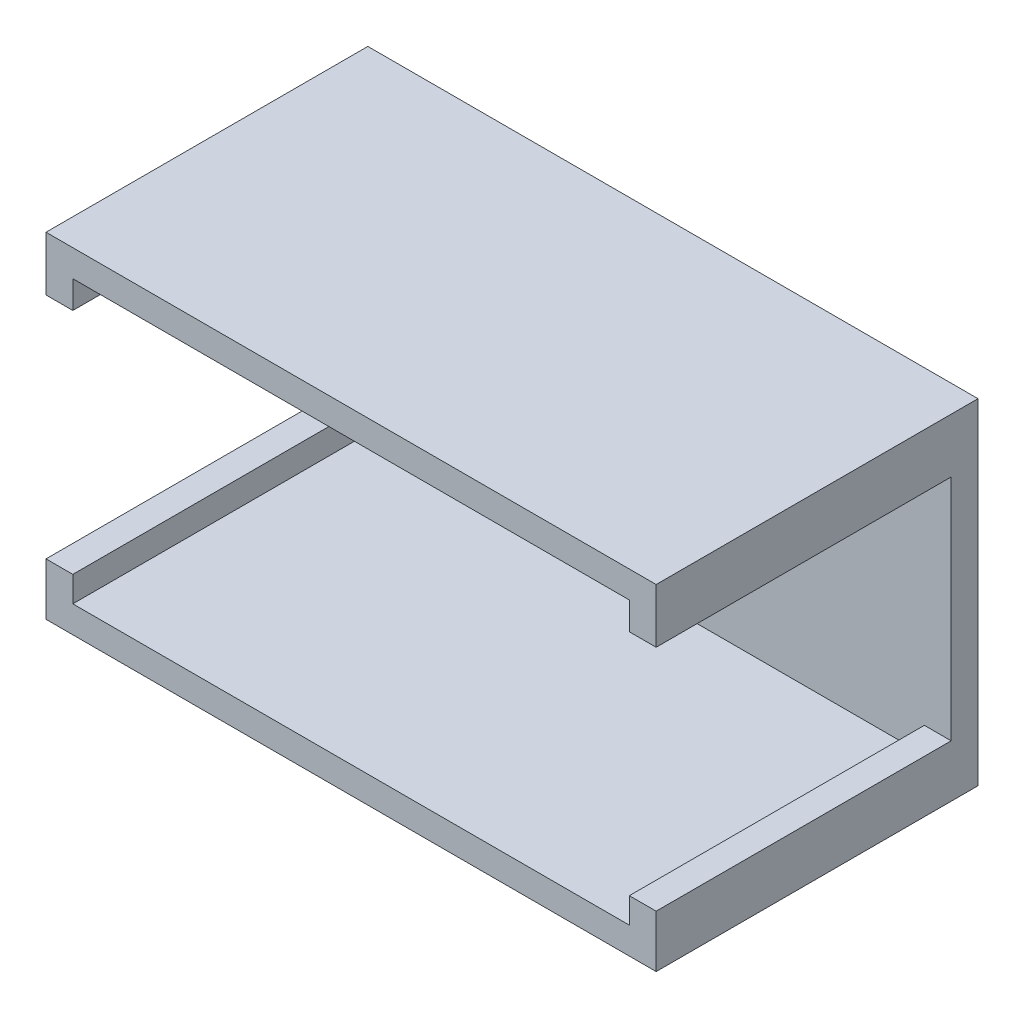
ISO-10303-21;
HEADER;
FILE_DESCRIPTION(('STEP AP214'),'2;1');
FILE_NAME('part.step','',(''),(''),'','','');
FILE_SCHEMA(('AUTOMOTIVE_DESIGN { 1 0 10303 214 1 1 1 1 }'));
ENDSEC;
DATA;
#1=APPLICATION_CONTEXT('core data for automotive mechanical design processes');
#2=APPLICATION_PROTOCOL_DEFINITION('international standard','automotive_design',2000,#1);
#3=PRODUCT_CONTEXT('',#1,'mechanical');
#4=PRODUCT('Part','Part','',(#3));
#5=PRODUCT_RELATED_PRODUCT_CATEGORY('part','',(#4));
#6=PRODUCT_DEFINITION_FORMATION('','',#4);
#7=PRODUCT_DEFINITION_CONTEXT('part definition',#1,'design');
#8=PRODUCT_DEFINITION('design','',#6,#7);
#9=PRODUCT_DEFINITION_SHAPE('','',#8);
#10=(LENGTH_UNIT() NAMED_UNIT(*) SI_UNIT(.MILLI.,.METRE.));
#11=(NAMED_UNIT(*) PLANE_ANGLE_UNIT() SI_UNIT($,.RADIAN.));
#12=(NAMED_UNIT(*) SI_UNIT($,.STERADIAN.) SOLID_ANGLE_UNIT());
#13=UNCERTAINTY_MEASURE_WITH_UNIT(LENGTH_MEASURE(1.E-05),#10,'distance_accuracy_value','');
#14=(GEOMETRIC_REPRESENTATION_CONTEXT(3) GLOBAL_UNCERTAINTY_ASSIGNED_CONTEXT((#13)) GLOBAL_UNIT_ASSIGNED_CONTEXT((#10,
#11,#12)) REPRESENTATION_CONTEXT('',''));
#15=CARTESIAN_POINT('',(0.,0.,0.));
#16=DIRECTION('',(0.,0.,1.));
#17=DIRECTION('',(1.,0.,0.));
#18=AXIS2_PLACEMENT_3D('',#15,#16,#17);
#19=CARTESIAN_POINT('',(-48.9395510953457,26.5034566253615,2.));
#20=DIRECTION('',(0.,-1.,0.));
#21=DIRECTION('',(0.,0.,-1.));
#22=AXIS2_PLACEMENT_3D('',#19,#20,#21);
#23=PLANE('',#22);
#24=DIRECTION('',(0.,0.,-1.));
#25=VECTOR('',#24,1.);
#26=CARTESIAN_POINT('',(-49.9395510953457,26.5034566253615,2.));
#27=LINE('',#26,#25);
#28=CARTESIAN_POINT('',(-49.9395510953457,26.5034566253615,24.));
#29=VERTEX_POINT('',#28);
#30=CARTESIAN_POINT('',(-49.9395510953457,26.5034566253615,0.));
#31=VERTEX_POINT('',#30);
#32=EDGE_CURVE('E11',#29,#31,#27,.T.);
#33=ORIENTED_EDGE('',*,*,#32,.F.);
#34=DIRECTION('',(1.,0.,0.));
#35=VECTOR('',#34,1.);
#36=CARTESIAN_POINT('',(-48.9395510953457,26.5034566253615,24.));
#37=LINE('',#36,#35);
#38=CARTESIAN_POINT('',(-4.43955109534567,26.5034566253615,24.));
#39=VERTEX_POINT('',#38);
#40=EDGE_CURVE('E149',#29,#39,#37,.T.);
#41=ORIENTED_EDGE('',*,*,#40,.T.);
#42=DIRECTION('',(0.,0.,-1.));
#43=VECTOR('',#42,1.);
#44=CARTESIAN_POINT('',(-4.43955109534567,26.5034566253615,2.));
#45=LINE('',#44,#43);
#46=CARTESIAN_POINT('',(-4.43955109534567,26.5034566253615,0.));
#47=VERTEX_POINT('',#46);
#48=EDGE_CURVE('E161',#39,#47,#45,.T.);
#49=ORIENTED_EDGE('',*,*,#48,.T.);
#50=DIRECTION('',(-1.,0.,0.));
#51=VECTOR('',#50,1.);
#52=CARTESIAN_POINT('',(-48.9395510953457,26.5034566253615,0.));
#53=LINE('',#52,#51);
#54=EDGE_CURVE('E171',#47,#31,#53,.T.);
#55=ORIENTED_EDGE('',*,*,#54,.T.);
#56=EDGE_LOOP('',(#33,#41,#49,#55));
#57=FACE_BOUND('',#56,.T.);
#58=ADVANCED_FACE('F33',(#57),#23,.F.);
#59=CARTESIAN_POINT('',(0.,0.,24.));
#60=DIRECTION('',(0.,0.,-1.));
#61=DIRECTION('',(-1.,0.,0.));
#62=AXIS2_PLACEMENT_3D('',#59,#60,#61);
#63=PLANE('',#62);
#64=DIRECTION('',(0.,1.,0.));
#65=VECTOR('',#64,1.);
#66=CARTESIAN_POINT('',(-4.43955109534567,26.5034566253615,24.));
#67=LINE('',#66,#65);
#68=CARTESIAN_POINT('',(-4.43955109534567,22.4484935609555,24.));
#69=VERTEX_POINT('',#68);
#70=EDGE_CURVE('E146',#69,#39,#67,.T.);
#71=ORIENTED_EDGE('',*,*,#70,.T.);
#72=ORIENTED_EDGE('',*,*,#40,.F.);
#73=DIRECTION('',(0.,-1.,0.));
#74=VECTOR('',#73,1.);
#75=CARTESIAN_POINT('',(-49.9395510953457,26.5034566253615,24.));
#76=LINE('',#75,#74);
#77=CARTESIAN_POINT('',(-49.9395510953457,22.4484935609555,24.));
#78=VERTEX_POINT('',#77);
#79=EDGE_CURVE('E210',#29,#78,#76,.T.);
#80=ORIENTED_EDGE('',*,*,#79,.T.);
#81=DIRECTION('',(1.,0.,0.));
#82=VECTOR('',#81,1.);
#83=CARTESIAN_POINT('',(0.,22.4484935609555,24.));
#84=LINE('',#83,#82);
#85=CARTESIAN_POINT('',(-47.9395510953457,22.4484935609555,24.));
#86=VERTEX_POINT('',#85);
#87=EDGE_CURVE('E245',#78,#86,#84,.T.);
#88=ORIENTED_EDGE('',*,*,#87,.T.);
#89=DIRECTION('',(0.,-1.,0.));
#90=VECTOR('',#89,1.);
#91=CARTESIAN_POINT('',(-47.9395510953457,5.50345662536146,24.));
#92=LINE('',#91,#90);
#93=CARTESIAN_POINT('',(-47.9395510953457,24.5034566253615,24.));
#94=VERTEX_POINT('',#93);
#95=EDGE_CURVE('E222',#94,#86,#92,.T.);
#96=ORIENTED_EDGE('',*,*,#95,.F.);
#97=DIRECTION('',(1.,0.,0.));
#98=VECTOR('',#97,1.);
#99=CARTESIAN_POINT('',(-47.9395510953457,24.5034566253615,24.));
#100=LINE('',#99,#98);
#101=CARTESIAN_POINT('',(-6.43955109534567,24.5034566253615,24.));
#102=VERTEX_POINT('',#101);
#103=EDGE_CURVE('E163',#94,#102,#100,.T.);
#104=ORIENTED_EDGE('',*,*,#103,.T.);
#105=DIRECTION('',(0.,1.,0.));
#106=VECTOR('',#105,1.);
#107=CARTESIAN_POINT('',(-6.43955109534567,24.5034566253615,24.));
#108=LINE('',#107,#106);
#109=CARTESIAN_POINT('',(-6.43955109534567,22.4484935609555,24.));
#110=VERTEX_POINT('',#109);
#111=EDGE_CURVE('E229',#110,#102,#108,.T.);
#112=ORIENTED_EDGE('',*,*,#111,.F.);
#113=EDGE_CURVE('E152',#110,#69,#84,.T.);
#114=ORIENTED_EDGE('',*,*,#113,.T.);
#115=EDGE_LOOP('',(#71,#72,#80,#88,#96,#104,#112,#114));
#116=FACE_BOUND('',#115,.T.);
#117=ADVANCED_FACE('F148',(#116),#63,.F.);
#118=CARTESIAN_POINT('',(-6.43955109534567,24.5034566253615,24.));
#119=DIRECTION('',(-1.,0.,0.));
#120=DIRECTION('',(0.,0.,1.));
#121=AXIS2_PLACEMENT_3D('',#118,#119,#120);
#122=PLANE('',#121);
#123=DIRECTION('',(0.,0.,-1.));
#124=VECTOR('',#123,1.);
#125=CARTESIAN_POINT('',(-6.43955109534567,22.4484935609555,24.));
#126=LINE('',#125,#124);
#127=CARTESIAN_POINT('',(-6.43955109534568,22.4484935609555,2.));
#128=VERTEX_POINT('',#127);
#129=EDGE_CURVE('E240',#110,#128,#126,.T.);
#130=ORIENTED_EDGE('',*,*,#129,.F.);
#131=ORIENTED_EDGE('',*,*,#111,.T.);
#132=DIRECTION('',(0.,0.,-1.));
#133=VECTOR('',#132,1.);
#134=CARTESIAN_POINT('',(-6.43955109534567,24.5034566253615,24.));
#135=LINE('',#134,#133);
#136=CARTESIAN_POINT('',(-6.43955109534567,24.5034566253615,2.));
#137=VERTEX_POINT('',#136);
#138=EDGE_CURVE('E215',#102,#137,#135,.T.);
#139=ORIENTED_EDGE('',*,*,#138,.T.);
#140=DIRECTION('',(0.,-1.,0.));
#141=VECTOR('',#140,1.);
#142=CARTESIAN_POINT('',(-6.43955109534567,0.,2.));
#143=LINE('',#142,#141);
#144=EDGE_CURVE('E191',#137,#128,#143,.T.);
#145=ORIENTED_EDGE('',*,*,#144,.T.);
#146=EDGE_LOOP('',(#130,#131,#139,#145));
#147=FACE_BOUND('',#146,.T.);
#148=ADVANCED_FACE('F274',(#147),#122,.T.);
#149=CARTESIAN_POINT('',(-47.9395510953457,3.50345662536146,24.));
#150=DIRECTION('',(1.,0.,0.));
#151=DIRECTION('',(0.,0.,-1.));
#152=AXIS2_PLACEMENT_3D('',#149,#150,#151);
#153=PLANE('',#152);
#154=DIRECTION('',(0.,0.,1.));
#155=VECTOR('',#154,1.);
#156=CARTESIAN_POINT('',(-47.9395510953457,22.4484935609555,24.));
#157=LINE('',#156,#155);
#158=CARTESIAN_POINT('',(-47.9395510953457,22.4484935609555,2.));
#159=VERTEX_POINT('',#158);
#160=EDGE_CURVE('E248',#159,#86,#157,.T.);
#161=ORIENTED_EDGE('',*,*,#160,.F.);
#162=DIRECTION('',(0.,1.,0.));
#163=VECTOR('',#162,1.);
#164=CARTESIAN_POINT('',(-47.9395510953457,0.,2.));
#165=LINE('',#164,#163);
#166=CARTESIAN_POINT('',(-47.9395510953457,24.5034566253615,2.));
#167=VERTEX_POINT('',#166);
#168=EDGE_CURVE('E204',#159,#167,#165,.T.);
#169=ORIENTED_EDGE('',*,*,#168,.T.);
#170=DIRECTION('',(0.,0.,-1.));
#171=VECTOR('',#170,1.);
#172=CARTESIAN_POINT('',(-47.9395510953457,24.5034566253615,24.));
#173=LINE('',#172,#171);
#174=EDGE_CURVE('E217',#94,#167,#173,.T.);
#175=ORIENTED_EDGE('',*,*,#174,.F.);
#176=ORIENTED_EDGE('',*,*,#95,.T.);
#177=EDGE_LOOP('',(#161,#169,#175,#176));
#178=FACE_BOUND('',#177,.T.);
#179=ADVANCED_FACE('F309',(#178),#153,.T.);
#180=CARTESIAN_POINT('',(-49.9395510953457,5.50345662536146,2.));
#181=DIRECTION('',(1.,0.,0.));
#182=DIRECTION('',(0.,0.,-1.));
#183=AXIS2_PLACEMENT_3D('',#180,#181,#182);
#184=PLANE('',#183);
#185=ORIENTED_EDGE('',*,*,#79,.F.);
#186=ORIENTED_EDGE('',*,*,#32,.T.);
#187=DIRECTION('',(0.,-1.,0.));
#188=VECTOR('',#187,1.);
#189=CARTESIAN_POINT('',(-49.9395510953457,5.50345662536146,0.));
#190=LINE('',#189,#188);
#191=CARTESIAN_POINT('',(-49.9395510953457,1.50345662536146,0.));
#192=VERTEX_POINT('',#191);
#193=EDGE_CURVE('E189',#31,#192,#190,.T.);
#194=ORIENTED_EDGE('',*,*,#193,.T.);
#195=DIRECTION('',(0.,0.,-1.));
#196=VECTOR('',#195,1.);
#197=CARTESIAN_POINT('',(-49.9395510953457,1.50345662536146,2.));
#198=LINE('',#197,#196);
#199=CARTESIAN_POINT('',(-49.9395510953457,1.50345662536146,24.));
#200=VERTEX_POINT('',#199);
#201=EDGE_CURVE('E41',#200,#192,#198,.T.);
#202=ORIENTED_EDGE('',*,*,#201,.F.);
#203=CARTESIAN_POINT('',(-49.9395510953457,5.40766491915159,24.));
#204=VERTEX_POINT('',#203);
#205=EDGE_CURVE('E187',#204,#200,#76,.T.);
#206=ORIENTED_EDGE('',*,*,#205,.F.);
#207=DIRECTION('',(0.,0.,-1.));
#208=VECTOR('',#207,1.);
#209=CARTESIAN_POINT('',(-49.9395510953457,5.40766491915159,2.));
#210=LINE('',#209,#208);
#211=CARTESIAN_POINT('',(-49.9395510953457,5.40766491915159,2.));
#212=VERTEX_POINT('',#211);
#213=EDGE_CURVE('E256',#204,#212,#210,.T.);
#214=ORIENTED_EDGE('',*,*,#213,.T.);
#215=DIRECTION('',(0.,1.,0.));
#216=VECTOR('',#215,1.);
#217=CARTESIAN_POINT('',(-49.9395510953457,5.50345662536146,2.));
#218=LINE('',#217,#216);
#219=CARTESIAN_POINT('',(-49.9395510953457,22.4484935609555,2.));
#220=VERTEX_POINT('',#219);
#221=EDGE_CURVE('E232',#212,#220,#218,.T.);
#222=ORIENTED_EDGE('',*,*,#221,.T.);
#223=DIRECTION('',(0.,0.,1.));
#224=VECTOR('',#223,1.);
#225=CARTESIAN_POINT('',(-49.9395510953457,22.4484935609555,2.));
#226=LINE('',#225,#224);
#227=EDGE_CURVE('E242',#220,#78,#226,.T.);
#228=ORIENTED_EDGE('',*,*,#227,.T.);
#229=EDGE_LOOP('',(#185,#186,#194,#202,#206,#214,#222,#228));
#230=FACE_BOUND('',#229,.T.);
#231=ADVANCED_FACE('F35',(#230),#184,.F.);
#232=CARTESIAN_POINT('',(-4.43955109534567,1.50345662536146,2.));
#233=DIRECTION('',(0.,1.,0.));
#234=DIRECTION('',(0.,0.,1.));
#235=AXIS2_PLACEMENT_3D('',#232,#233,#234);
#236=PLANE('',#235);
#237=DIRECTION('',(1.,0.,0.));
#238=VECTOR('',#237,1.);
#239=CARTESIAN_POINT('',(-4.43955109534567,1.50345662536146,0.));
#240=LINE('',#239,#238);
#241=CARTESIAN_POINT('',(-4.43955109534567,1.50345662536146,0.));
#242=VERTEX_POINT('',#241);
#243=EDGE_CURVE('E181',#192,#242,#240,.T.);
#244=ORIENTED_EDGE('',*,*,#243,.T.);
#245=DIRECTION('',(0.,0.,-1.));
#246=VECTOR('',#245,1.);
#247=CARTESIAN_POINT('',(-4.43955109534567,1.50345662536146,2.));
#248=LINE('',#247,#246);
#249=CARTESIAN_POINT('',(-4.43955109534568,1.50345662536146,24.));
#250=VERTEX_POINT('',#249);
#251=EDGE_CURVE('E170',#250,#242,#248,.T.);
#252=ORIENTED_EDGE('',*,*,#251,.F.);
#253=DIRECTION('',(1.,0.,0.));
#254=VECTOR('',#253,1.);
#255=CARTESIAN_POINT('',(-4.43955109534568,1.50345662536146,24.));
#256=LINE('',#255,#254);
#257=EDGE_CURVE('E157',#200,#250,#256,.T.);
#258=ORIENTED_EDGE('',*,*,#257,.F.);
#259=ORIENTED_EDGE('',*,*,#201,.T.);
#260=EDGE_LOOP('',(#244,#252,#258,#259));
#261=FACE_BOUND('',#260,.T.);
#262=ADVANCED_FACE('F180',(#261),#236,.F.);
#263=CARTESIAN_POINT('',(-4.43955109534567,26.5034566253615,2.));
#264=DIRECTION('',(-1.,0.,0.));
#265=DIRECTION('',(0.,0.,1.));
#266=AXIS2_PLACEMENT_3D('',#263,#264,#265);
#267=PLANE('',#266);
#268=ORIENTED_EDGE('',*,*,#48,.F.);
#269=ORIENTED_EDGE('',*,*,#70,.F.);
#270=DIRECTION('',(0.,0.,-1.));
#271=VECTOR('',#270,1.);
#272=CARTESIAN_POINT('',(-4.43955109534567,22.4484935609555,2.));
#273=LINE('',#272,#271);
#274=CARTESIAN_POINT('',(-4.43955109534568,22.4484935609555,2.));
#275=VERTEX_POINT('',#274);
#276=EDGE_CURVE('E238',#69,#275,#273,.T.);
#277=ORIENTED_EDGE('',*,*,#276,.T.);
#278=DIRECTION('',(0.,-1.,0.));
#279=VECTOR('',#278,1.);
#280=CARTESIAN_POINT('',(-4.43955109534567,26.5034566253615,2.));
#281=LINE('',#280,#279);
#282=CARTESIAN_POINT('',(-4.43955109534568,5.40766491915159,2.));
#283=VERTEX_POINT('',#282);
#284=EDGE_CURVE('E235',#275,#283,#281,.T.);
#285=ORIENTED_EDGE('',*,*,#284,.T.);
#286=DIRECTION('',(0.,0.,1.));
#287=VECTOR('',#286,1.);
#288=CARTESIAN_POINT('',(-4.43955109534567,5.40766491915159,2.));
#289=LINE('',#288,#287);
#290=CARTESIAN_POINT('',(-4.43955109534567,5.40766491915159,24.));
#291=VERTEX_POINT('',#290);
#292=EDGE_CURVE('E250',#283,#291,#289,.T.);
#293=ORIENTED_EDGE('',*,*,#292,.T.);
#294=EDGE_CURVE('E156',#250,#291,#67,.T.);
#295=ORIENTED_EDGE('',*,*,#294,.F.);
#296=ORIENTED_EDGE('',*,*,#251,.T.);
#297=DIRECTION('',(0.,1.,0.));
#298=VECTOR('',#297,1.);
#299=CARTESIAN_POINT('',(-4.43955109534567,26.5034566253615,0.));
#300=LINE('',#299,#298);
#301=EDGE_CURVE('E169',#242,#47,#300,.T.);
#302=ORIENTED_EDGE('',*,*,#301,.T.);
#303=EDGE_LOOP('',(#268,#269,#277,#285,#293,#295,#296,#302));
#304=FACE_BOUND('',#303,.T.);
#305=ADVANCED_FACE('F166',(#304),#267,.F.);
#306=CARTESIAN_POINT('',(0.,0.,0.));
#307=DIRECTION('',(0.,0.,1.));
#308=DIRECTION('',(1.,0.,0.));
#309=AXIS2_PLACEMENT_3D('',#306,#307,#308);
#310=PLANE('',#309);
#311=ORIENTED_EDGE('',*,*,#193,.F.);
#312=ORIENTED_EDGE('',*,*,#54,.F.);
#313=ORIENTED_EDGE('',*,*,#301,.F.);
#314=ORIENTED_EDGE('',*,*,#243,.F.);
#315=EDGE_LOOP('',(#311,#312,#313,#314));
#316=FACE_BOUND('',#315,.T.);
#317=ADVANCED_FACE('F329',(#316),#310,.F.);
#318=ORIENTED_EDGE('',*,*,#294,.T.);
#319=DIRECTION('',(-1.,0.,0.));
#320=VECTOR('',#319,1.);
#321=CARTESIAN_POINT('',(0.,5.40766491915159,24.));
#322=LINE('',#321,#320);
#323=CARTESIAN_POINT('',(-6.43955109534567,5.40766491915159,24.));
#324=VERTEX_POINT('',#323);
#325=EDGE_CURVE('E253',#291,#324,#322,.T.);
#326=ORIENTED_EDGE('',*,*,#325,.T.);
#327=CARTESIAN_POINT('',(-6.43955109534567,3.50345662536146,24.));
#328=VERTEX_POINT('',#327);
#329=EDGE_CURVE('E226',#328,#324,#108,.T.);
#330=ORIENTED_EDGE('',*,*,#329,.F.);
#331=DIRECTION('',(1.,0.,0.));
#332=VECTOR('',#331,1.);
#333=CARTESIAN_POINT('',(-6.43955109534567,3.50345662536146,24.));
#334=LINE('',#333,#332);
#335=CARTESIAN_POINT('',(-47.9395510953457,3.50345662536146,24.));
#336=VERTEX_POINT('',#335);
#337=EDGE_CURVE('E230',#336,#328,#334,.T.);
#338=ORIENTED_EDGE('',*,*,#337,.F.);
#339=CARTESIAN_POINT('',(-47.9395510953457,5.40766491915159,24.));
#340=VERTEX_POINT('',#339);
#341=EDGE_CURVE('E225',#340,#336,#92,.T.);
#342=ORIENTED_EDGE('',*,*,#341,.F.);
#343=EDGE_CURVE('E48',#340,#204,#322,.T.);
#344=ORIENTED_EDGE('',*,*,#343,.T.);
#345=ORIENTED_EDGE('',*,*,#205,.T.);
#346=ORIENTED_EDGE('',*,*,#257,.T.);
#347=EDGE_LOOP('',(#318,#326,#330,#338,#342,#344,#345,#346));
#348=FACE_BOUND('',#347,.T.);
#349=ADVANCED_FACE('F290',(#348),#63,.F.);
#350=DIRECTION('',(0.,0.,1.));
#351=VECTOR('',#350,1.);
#352=CARTESIAN_POINT('',(-6.43955109534567,5.40766491915159,24.));
#353=LINE('',#352,#351);
#354=CARTESIAN_POINT('',(-6.43955109534567,5.40766491915159,2.));
#355=VERTEX_POINT('',#354);
#356=EDGE_CURVE('E254',#355,#324,#353,.T.);
#357=ORIENTED_EDGE('',*,*,#356,.F.);
#358=CARTESIAN_POINT('',(-6.43955109534567,3.50345662536146,2.));
#359=VERTEX_POINT('',#358);
#360=EDGE_CURVE('E195',#355,#359,#143,.T.);
#361=ORIENTED_EDGE('',*,*,#360,.T.);
#362=DIRECTION('',(0.,0.,-1.));
#363=VECTOR('',#362,1.);
#364=CARTESIAN_POINT('',(-6.43955109534567,3.50345662536146,24.));
#365=LINE('',#364,#363);
#366=EDGE_CURVE('E212',#328,#359,#365,.T.);
#367=ORIENTED_EDGE('',*,*,#366,.F.);
#368=ORIENTED_EDGE('',*,*,#329,.T.);
#369=EDGE_LOOP('',(#357,#361,#367,#368));
#370=FACE_BOUND('',#369,.T.);
#371=ADVANCED_FACE('F317',(#370),#122,.T.);
#372=CARTESIAN_POINT('',(-47.9395510953457,24.5034566253615,24.));
#373=DIRECTION('',(0.,-1.,0.));
#374=DIRECTION('',(0.,0.,-1.));
#375=AXIS2_PLACEMENT_3D('',#372,#373,#374);
#376=PLANE('',#375);
#377=ORIENTED_EDGE('',*,*,#103,.F.);
#378=ORIENTED_EDGE('',*,*,#174,.T.);
#379=DIRECTION('',(1.,0.,0.));
#380=VECTOR('',#379,1.);
#381=CARTESIAN_POINT('',(0.,24.5034566253615,2.));
#382=LINE('',#381,#380);
#383=EDGE_CURVE('E198',#167,#137,#382,.T.);
#384=ORIENTED_EDGE('',*,*,#383,.T.);
#385=ORIENTED_EDGE('',*,*,#138,.F.);
#386=EDGE_LOOP('',(#377,#378,#384,#385));
#387=FACE_BOUND('',#386,.T.);
#388=ADVANCED_FACE('F276',(#387),#376,.T.);
#389=DIRECTION('',(0.,0.,-1.));
#390=VECTOR('',#389,1.);
#391=CARTESIAN_POINT('',(-47.9395510953457,5.40766491915159,24.));
#392=LINE('',#391,#390);
#393=CARTESIAN_POINT('',(-47.9395510953457,5.40766491915159,2.));
#394=VERTEX_POINT('',#393);
#395=EDGE_CURVE('E259',#340,#394,#392,.T.);
#396=ORIENTED_EDGE('',*,*,#395,.F.);
#397=ORIENTED_EDGE('',*,*,#341,.T.);
#398=DIRECTION('',(0.,0.,-1.));
#399=VECTOR('',#398,1.);
#400=CARTESIAN_POINT('',(-47.9395510953457,3.50345662536146,24.));
#401=LINE('',#400,#399);
#402=CARTESIAN_POINT('',(-47.9395510953457,3.50345662536146,2.));
#403=VERTEX_POINT('',#402);
#404=EDGE_CURVE('E219',#336,#403,#401,.T.);
#405=ORIENTED_EDGE('',*,*,#404,.T.);
#406=EDGE_CURVE('E201',#403,#394,#165,.T.);
#407=ORIENTED_EDGE('',*,*,#406,.T.);
#408=EDGE_LOOP('',(#396,#397,#405,#407));
#409=FACE_BOUND('',#408,.T.);
#410=ADVANCED_FACE('F296',(#409),#153,.T.);
#411=CARTESIAN_POINT('',(-10.4395510953457,3.50345662536146,24.));
#412=DIRECTION('',(0.,1.,0.));
#413=DIRECTION('',(0.,0.,1.));
#414=AXIS2_PLACEMENT_3D('',#411,#412,#413);
#415=PLANE('',#414);
#416=ORIENTED_EDGE('',*,*,#366,.T.);
#417=DIRECTION('',(-1.,0.,0.));
#418=VECTOR('',#417,1.);
#419=CARTESIAN_POINT('',(0.,3.50345662536146,2.));
#420=LINE('',#419,#418);
#421=EDGE_CURVE('E205',#359,#403,#420,.T.);
#422=ORIENTED_EDGE('',*,*,#421,.T.);
#423=ORIENTED_EDGE('',*,*,#404,.F.);
#424=ORIENTED_EDGE('',*,*,#337,.T.);
#425=EDGE_LOOP('',(#416,#422,#423,#424));
#426=FACE_BOUND('',#425,.T.);
#427=ADVANCED_FACE('F298',(#426),#415,.T.);
#428=CARTESIAN_POINT('',(0.,0.,2.));
#429=DIRECTION('',(0.,0.,1.));
#430=DIRECTION('',(1.,0.,0.));
#431=AXIS2_PLACEMENT_3D('',#428,#429,#430);
#432=PLANE('',#431);
#433=ORIENTED_EDGE('',*,*,#360,.F.);
#434=DIRECTION('',(1.,0.,0.));
#435=VECTOR('',#434,1.);
#436=CARTESIAN_POINT('',(-70.1,5.40766491915159,2.));
#437=LINE('',#436,#435);
#438=EDGE_CURVE('E56',#355,#283,#437,.T.);
#439=ORIENTED_EDGE('',*,*,#438,.T.);
#440=ORIENTED_EDGE('',*,*,#284,.F.);
#441=DIRECTION('',(1.,0.,0.));
#442=VECTOR('',#441,1.);
#443=CARTESIAN_POINT('',(-70.1,22.4484935609555,2.));
#444=LINE('',#443,#442);
#445=EDGE_CURVE('E264',#128,#275,#444,.T.);
#446=ORIENTED_EDGE('',*,*,#445,.F.);
#447=ORIENTED_EDGE('',*,*,#144,.F.);
#448=ORIENTED_EDGE('',*,*,#383,.F.);
#449=ORIENTED_EDGE('',*,*,#168,.F.);
#450=EDGE_CURVE('E261',#220,#159,#444,.T.);
#451=ORIENTED_EDGE('',*,*,#450,.F.);
#452=ORIENTED_EDGE('',*,*,#221,.F.);
#453=EDGE_CURVE('E263',#212,#394,#437,.T.);
#454=ORIENTED_EDGE('',*,*,#453,.T.);
#455=ORIENTED_EDGE('',*,*,#406,.F.);
#456=ORIENTED_EDGE('',*,*,#421,.F.);
#457=EDGE_LOOP('',(#433,#439,#440,#446,#447,#448,#449,#451,#452,#454,#455,#456));
#458=FACE_BOUND('',#457,.T.);
#459=ADVANCED_FACE('F282',(#458),#432,.T.);
#460=CARTESIAN_POINT('',(-70.1,5.40766491915159,2.));
#461=DIRECTION('',(0.,-1.,0.));
#462=DIRECTION('',(0.,0.,-1.));
#463=AXIS2_PLACEMENT_3D('',#460,#461,#462);
#464=PLANE('',#463);
#465=ORIENTED_EDGE('',*,*,#343,.F.);
#466=ORIENTED_EDGE('',*,*,#395,.T.);
#467=ORIENTED_EDGE('',*,*,#453,.F.);
#468=ORIENTED_EDGE('',*,*,#213,.F.);
#469=EDGE_LOOP('',(#465,#466,#467,#468));
#470=FACE_BOUND('',#469,.T.);
#471=ADVANCED_FACE('F303',(#470),#464,.F.);
#472=CARTESIAN_POINT('',(-70.1,22.4484935609555,2.));
#473=DIRECTION('',(0.,1.,0.));
#474=DIRECTION('',(0.,0.,1.));
#475=AXIS2_PLACEMENT_3D('',#472,#473,#474);
#476=PLANE('',#475);
#477=ORIENTED_EDGE('',*,*,#450,.T.);
#478=ORIENTED_EDGE('',*,*,#160,.T.);
#479=ORIENTED_EDGE('',*,*,#87,.F.);
#480=ORIENTED_EDGE('',*,*,#227,.F.);
#481=EDGE_LOOP('',(#477,#478,#479,#480));
#482=FACE_BOUND('',#481,.T.);
#483=ADVANCED_FACE('F306',(#482),#476,.F.);
#484=ORIENTED_EDGE('',*,*,#113,.F.);
#485=ORIENTED_EDGE('',*,*,#129,.T.);
#486=ORIENTED_EDGE('',*,*,#445,.T.);
#487=ORIENTED_EDGE('',*,*,#276,.F.);
#488=EDGE_LOOP('',(#484,#485,#486,#487));
#489=FACE_BOUND('',#488,.T.);
#490=ADVANCED_FACE('F286',(#489),#476,.F.);
#491=ORIENTED_EDGE('',*,*,#438,.F.);
#492=ORIENTED_EDGE('',*,*,#356,.T.);
#493=ORIENTED_EDGE('',*,*,#325,.F.);
#494=ORIENTED_EDGE('',*,*,#292,.F.);
#495=EDGE_LOOP('',(#491,#492,#493,#494));
#496=FACE_BOUND('',#495,.T.);
#497=ADVANCED_FACE('F383',(#496),#464,.F.);
#498=CLOSED_SHELL('',(#58,#117,#148,#179,#231,#262,#305,#317,#349,#371,#388,#410,#427,#459,#471,
#483,#490,#497));
#499=MANIFOLD_SOLID_BREP('B2',#498);
#500=ADVANCED_BREP_SHAPE_REPRESENTATION('',(#18,#499),#14);
#501=SHAPE_DEFINITION_REPRESENTATION(#9,#500);
ENDSEC;
END-ISO-10303-21;
